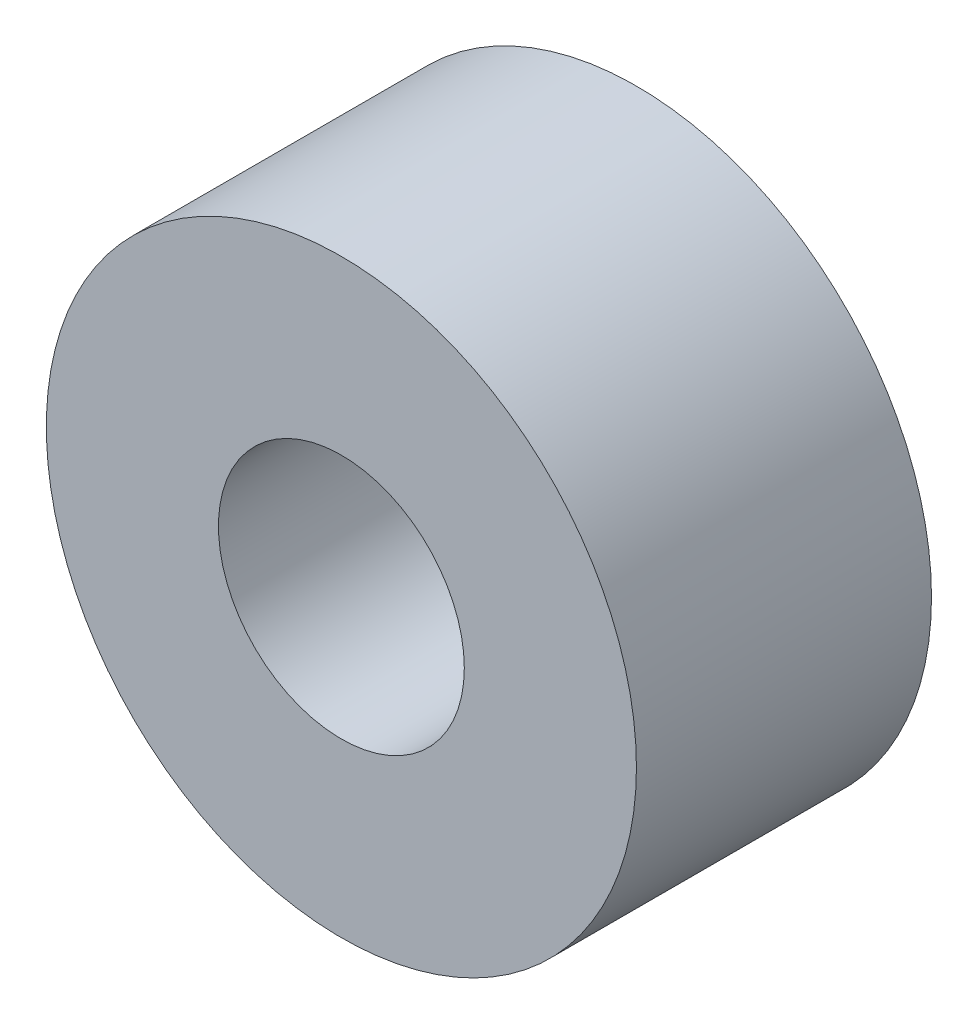
ISO-10303-21;
HEADER;
FILE_DESCRIPTION(('STEP AP214'),'2;1');
FILE_NAME('part.step','',(''),(''),'','','');
FILE_SCHEMA(('AUTOMOTIVE_DESIGN { 1 0 10303 214 1 1 1 1 }'));
ENDSEC;
DATA;
#1=APPLICATION_CONTEXT('core data for automotive mechanical design processes');
#2=APPLICATION_PROTOCOL_DEFINITION('international standard','automotive_design',2000,#1);
#3=PRODUCT_CONTEXT('',#1,'mechanical');
#4=PRODUCT('Part','Part','',(#3));
#5=PRODUCT_RELATED_PRODUCT_CATEGORY('part','',(#4));
#6=PRODUCT_DEFINITION_FORMATION('','',#4);
#7=PRODUCT_DEFINITION_CONTEXT('part definition',#1,'design');
#8=PRODUCT_DEFINITION('design','',#6,#7);
#9=PRODUCT_DEFINITION_SHAPE('','',#8);
#10=(LENGTH_UNIT() NAMED_UNIT(*) SI_UNIT(.MILLI.,.METRE.));
#11=(NAMED_UNIT(*) PLANE_ANGLE_UNIT() SI_UNIT($,.RADIAN.));
#12=(NAMED_UNIT(*) SI_UNIT($,.STERADIAN.) SOLID_ANGLE_UNIT());
#13=UNCERTAINTY_MEASURE_WITH_UNIT(LENGTH_MEASURE(1.E-05),#10,'distance_accuracy_value','');
#14=(GEOMETRIC_REPRESENTATION_CONTEXT(3) GLOBAL_UNCERTAINTY_ASSIGNED_CONTEXT((#13)) GLOBAL_UNIT_ASSIGNED_CONTEXT((#10,
#11,#12)) REPRESENTATION_CONTEXT('',''));
#15=CARTESIAN_POINT('',(0.,0.,0.));
#16=DIRECTION('',(0.,0.,1.));
#17=DIRECTION('',(1.,0.,0.));
#18=AXIS2_PLACEMENT_3D('',#15,#16,#17);
#19=CARTESIAN_POINT('',(0.,0.,18.));
#20=DIRECTION('',(0.,0.,1.));
#21=DIRECTION('',(1.,0.,0.));
#22=AXIS2_PLACEMENT_3D('',#19,#20,#21);
#23=PLANE('',#22);
#24=CARTESIAN_POINT('',(0.,0.,18.));
#25=DIRECTION('',(0.,0.,1.));
#26=DIRECTION('',(1.,0.,0.));
#27=AXIS2_PLACEMENT_3D('',#24,#25,#26);
#28=CIRCLE('',#27,18.);
#29=CARTESIAN_POINT('',(18.,0.,18.));
#30=VERTEX_POINT('',#29);
#31=EDGE_CURVE('E10',#30,#30,#28,.T.);
#32=ORIENTED_EDGE('',*,*,#31,.T.);
#33=EDGE_LOOP('',(#32));
#34=FACE_BOUND('',#33,.T.);
#35=CARTESIAN_POINT('',(0.,0.,18.));
#36=DIRECTION('',(0.,0.,1.));
#37=DIRECTION('',(1.,0.,0.));
#38=AXIS2_PLACEMENT_3D('',#35,#36,#37);
#39=CIRCLE('',#38,7.5);
#40=CARTESIAN_POINT('',(7.5,0.,18.));
#41=VERTEX_POINT('',#40);
#42=EDGE_CURVE('E50',#41,#41,#39,.T.);
#43=ORIENTED_EDGE('',*,*,#42,.F.);
#44=EDGE_LOOP('',(#43));
#45=FACE_BOUND('',#44,.T.);
#46=ADVANCED_FACE('F37',(#34,#45),#23,.T.);
#47=CARTESIAN_POINT('',(0.,0.,0.));
#48=DIRECTION('',(0.,0.,1.));
#49=DIRECTION('',(1.,0.,0.));
#50=AXIS2_PLACEMENT_3D('',#47,#48,#49);
#51=PLANE('',#50);
#52=CARTESIAN_POINT('',(0.,0.,0.));
#53=DIRECTION('',(0.,0.,1.));
#54=DIRECTION('',(1.,0.,0.));
#55=AXIS2_PLACEMENT_3D('',#52,#53,#54);
#56=CIRCLE('',#55,18.);
#57=CARTESIAN_POINT('',(18.,0.,0.));
#58=VERTEX_POINT('',#57);
#59=EDGE_CURVE('E41',#58,#58,#56,.T.);
#60=ORIENTED_EDGE('',*,*,#59,.F.);
#61=EDGE_LOOP('',(#60));
#62=FACE_BOUND('',#61,.T.);
#63=CARTESIAN_POINT('',(0.,0.,0.));
#64=DIRECTION('',(0.,0.,1.));
#65=DIRECTION('',(1.,0.,0.));
#66=AXIS2_PLACEMENT_3D('',#63,#64,#65);
#67=CIRCLE('',#66,7.5);
#68=CARTESIAN_POINT('',(7.5,0.,0.));
#69=VERTEX_POINT('',#68);
#70=EDGE_CURVE('E52',#69,#69,#67,.T.);
#71=ORIENTED_EDGE('',*,*,#70,.T.);
#72=EDGE_LOOP('',(#71));
#73=FACE_BOUND('',#72,.T.);
#74=ADVANCED_FACE('F64',(#62,#73),#51,.F.);
#75=CARTESIAN_POINT('',(0.,0.,18.));
#76=DIRECTION('',(0.,0.,-1.));
#77=DIRECTION('',(-1.,0.,0.));
#78=AXIS2_PLACEMENT_3D('',#75,#76,#77);
#79=CYLINDRICAL_SURFACE('',#78,18.);
#80=ORIENTED_EDGE('',*,*,#31,.F.);
#81=EDGE_LOOP('',(#80));
#82=FACE_BOUND('',#81,.T.);
#83=ORIENTED_EDGE('',*,*,#59,.T.);
#84=EDGE_LOOP('',(#83));
#85=FACE_BOUND('',#84,.T.);
#86=ADVANCED_FACE('F39',(#82,#85),#79,.T.);
#87=CARTESIAN_POINT('',(0.,0.,18.));
#88=DIRECTION('',(0.,0.,-1.));
#89=DIRECTION('',(-1.,0.,0.));
#90=AXIS2_PLACEMENT_3D('',#87,#88,#89);
#91=CYLINDRICAL_SURFACE('',#90,7.5);
#92=ORIENTED_EDGE('',*,*,#42,.T.);
#93=EDGE_LOOP('',(#92));
#94=FACE_BOUND('',#93,.T.);
#95=ORIENTED_EDGE('',*,*,#70,.F.);
#96=EDGE_LOOP('',(#95));
#97=FACE_BOUND('',#96,.T.);
#98=ADVANCED_FACE('F60',(#94,#97),#91,.F.);
#99=CLOSED_SHELL('',(#46,#74,#86,#98));
#100=MANIFOLD_SOLID_BREP('B2',#99);
#101=ADVANCED_BREP_SHAPE_REPRESENTATION('',(#18,#100),#14);
#102=SHAPE_DEFINITION_REPRESENTATION(#9,#101);
ENDSEC;
END-ISO-10303-21;
